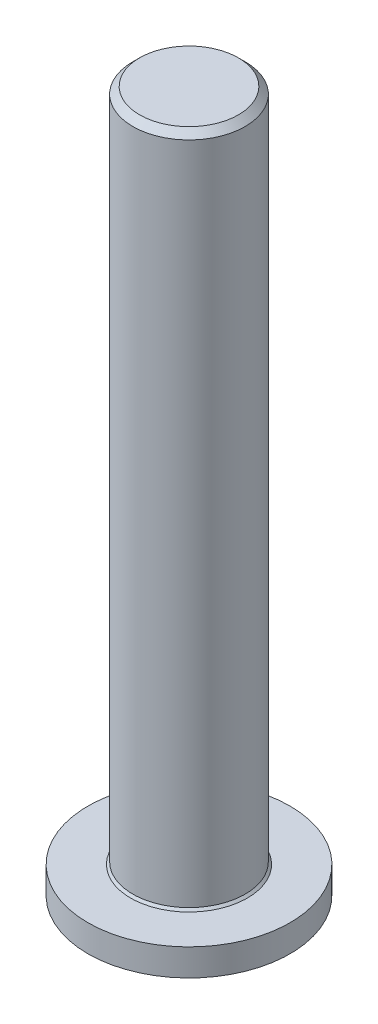
ISO-10303-21;
HEADER;
FILE_DESCRIPTION(('STEP AP214'),'2;1');
FILE_NAME('part.step','',(''),(''),'','','');
FILE_SCHEMA(('AUTOMOTIVE_DESIGN { 1 0 10303 214 1 1 1 1 }'));
ENDSEC;
DATA;
#1=APPLICATION_CONTEXT('core data for automotive mechanical design processes');
#2=APPLICATION_PROTOCOL_DEFINITION('international standard','automotive_design',2000,#1);
#3=PRODUCT_CONTEXT('',#1,'mechanical');
#4=PRODUCT('Part','Part','',(#3));
#5=PRODUCT_RELATED_PRODUCT_CATEGORY('part','',(#4));
#6=PRODUCT_DEFINITION_FORMATION('','',#4);
#7=PRODUCT_DEFINITION_CONTEXT('part definition',#1,'design');
#8=PRODUCT_DEFINITION('design','',#6,#7);
#9=PRODUCT_DEFINITION_SHAPE('','',#8);
#10=(LENGTH_UNIT() NAMED_UNIT(*) SI_UNIT(.MILLI.,.METRE.));
#11=(NAMED_UNIT(*) PLANE_ANGLE_UNIT() SI_UNIT($,.RADIAN.));
#12=(NAMED_UNIT(*) SI_UNIT($,.STERADIAN.) SOLID_ANGLE_UNIT());
#13=UNCERTAINTY_MEASURE_WITH_UNIT(LENGTH_MEASURE(1.E-05),#10,'distance_accuracy_value','');
#14=(GEOMETRIC_REPRESENTATION_CONTEXT(3) GLOBAL_UNCERTAINTY_ASSIGNED_CONTEXT((#13)) GLOBAL_UNIT_ASSIGNED_CONTEXT((#10,
#11,#12)) REPRESENTATION_CONTEXT('',''));
#15=CARTESIAN_POINT('',(0.,0.,0.));
#16=DIRECTION('',(0.,0.,1.));
#17=DIRECTION('',(1.,0.,0.));
#18=AXIS2_PLACEMENT_3D('',#15,#16,#17);
#19=CARTESIAN_POINT('',(0.,1.5,0.));
#20=DIRECTION('',(0.,1.,0.));
#21=DIRECTION('',(0.,0.,1.));
#22=AXIS2_PLACEMENT_3D('',#19,#20,#21);
#23=PLANE('',#22);
#24=CARTESIAN_POINT('',(0.,1.5,0.));
#25=DIRECTION('',(0.,1.,0.));
#26=DIRECTION('',(0.,0.,1.));
#27=AXIS2_PLACEMENT_3D('',#24,#25,#26);
#28=CIRCLE('',#27,2.59999999999999);
#29=CARTESIAN_POINT('',(0.,1.5,-2.59999999999999));
#30=VERTEX_POINT('',#29);
#31=EDGE_CURVE('E148',#30,#30,#28,.F.);
#32=ORIENTED_EDGE('',*,*,#31,.T.);
#33=EDGE_LOOP('',(#32));
#34=FACE_BOUND('',#33,.T.);
#35=CARTESIAN_POINT('',(0.,1.5,0.));
#36=DIRECTION('',(0.,1.,0.));
#37=DIRECTION('',(0.,0.,1.));
#38=AXIS2_PLACEMENT_3D('',#35,#36,#37);
#39=CIRCLE('',#38,4.5);
#40=CARTESIAN_POINT('',(0.,1.5,4.5));
#41=VERTEX_POINT('',#40);
#42=EDGE_CURVE('E137',#41,#41,#39,.T.);
#43=ORIENTED_EDGE('',*,*,#42,.T.);
#44=EDGE_LOOP('',(#43));
#45=FACE_BOUND('',#44,.T.);
#46=ADVANCED_FACE('F35',(#34,#45),#23,.T.);
#47=CARTESIAN_POINT('',(0.,1.5,0.));
#48=DIRECTION('',(0.,-1.,0.));
#49=DIRECTION('',(0.,0.,-1.));
#50=AXIS2_PLACEMENT_3D('',#47,#48,#49);
#51=CYLINDRICAL_SURFACE('',#50,4.5);
#52=CARTESIAN_POINT('',(0.,0.3,0.));
#53=DIRECTION('',(0.,1.,0.));
#54=DIRECTION('',(0.,0.,1.));
#55=AXIS2_PLACEMENT_3D('',#52,#53,#54);
#56=CIRCLE('',#55,4.5);
#57=CARTESIAN_POINT('',(0.,0.3,4.5));
#58=VERTEX_POINT('',#57);
#59=EDGE_CURVE('E151',#58,#58,#56,.T.);
#60=ORIENTED_EDGE('',*,*,#59,.T.);
#61=EDGE_LOOP('',(#60));
#62=FACE_BOUND('',#61,.T.);
#63=ORIENTED_EDGE('',*,*,#42,.F.);
#64=EDGE_LOOP('',(#63));
#65=FACE_BOUND('',#64,.T.);
#66=ADVANCED_FACE('F170',(#62,#65),#51,.T.);
#67=CARTESIAN_POINT('',(0.,0.,0.));
#68=DIRECTION('',(0.,1.,0.));
#69=DIRECTION('',(0.,0.,1.));
#70=AXIS2_PLACEMENT_3D('',#67,#68,#69);
#71=PLANE('',#70);
#72=DIRECTION('',(-0.717801415460528,0.,-0.696247892609279));
#73=VECTOR('',#72,1.);
#74=CARTESIAN_POINT('',(-0.422737578252671,0.,1.6796704855218));
#75=LINE('',#74,#73);
#76=CARTESIAN_POINT('',(-0.422737578252671,0.,1.6796704855218));
#77=VERTEX_POINT('',#76);
#78=CARTESIAN_POINT('',(-1.66600609957516,0.,0.473733760859775));
#79=VERTEX_POINT('',#78);
#80=EDGE_CURVE('E124',#77,#79,#75,.T.);
#81=ORIENTED_EDGE('',*,*,#80,.F.);
#82=DIRECTION('',(-0.961869070061279,0.,0.273510314356606));
#83=VECTOR('',#82,1.);
#84=CARTESIAN_POINT('',(1.24326852132249,0.,1.20593672466203));
#85=LINE('',#84,#83);
#86=CARTESIAN_POINT('',(1.24326852132249,0.,1.20593672466203));
#87=VERTEX_POINT('',#86);
#88=EDGE_CURVE('E50',#87,#77,#85,.T.);
#89=ORIENTED_EDGE('',*,*,#88,.F.);
#90=DIRECTION('',(-0.244067654600751,0.,0.969758206965885));
#91=VECTOR('',#90,1.);
#92=CARTESIAN_POINT('',(1.66600609957516,0.,-0.473733760859776));
#93=LINE('',#92,#91);
#94=CARTESIAN_POINT('',(1.66600609957516,0.,-0.473733760859776));
#95=VERTEX_POINT('',#94);
#96=EDGE_CURVE('E133',#95,#87,#93,.T.);
#97=ORIENTED_EDGE('',*,*,#96,.F.);
#98=DIRECTION('',(0.717801415460528,0.,0.696247892609279));
#99=VECTOR('',#98,1.);
#100=CARTESIAN_POINT('',(0.422737578252671,0.,-1.6796704855218));
#101=LINE('',#100,#99);
#102=CARTESIAN_POINT('',(0.422737578252671,0.,-1.6796704855218));
#103=VERTEX_POINT('',#102);
#104=EDGE_CURVE('E131',#103,#95,#101,.T.);
#105=ORIENTED_EDGE('',*,*,#104,.F.);
#106=DIRECTION('',(0.961869070061279,0.,-0.273510314356606));
#107=VECTOR('',#106,1.);
#108=CARTESIAN_POINT('',(-1.24326852132249,0.,-1.20593672466203));
#109=LINE('',#108,#107);
#110=CARTESIAN_POINT('',(-1.24326852132249,0.,-1.20593672466203));
#111=VERTEX_POINT('',#110);
#112=EDGE_CURVE('E98',#111,#103,#109,.T.);
#113=ORIENTED_EDGE('',*,*,#112,.F.);
#114=DIRECTION('',(0.244067654600751,0.,-0.969758206965885));
#115=VECTOR('',#114,1.);
#116=CARTESIAN_POINT('',(-1.66600609957516,0.,0.473733760859775));
#117=LINE('',#116,#115);
#118=EDGE_CURVE('E127',#79,#111,#117,.T.);
#119=ORIENTED_EDGE('',*,*,#118,.F.);
#120=EDGE_LOOP('',(#81,#89,#97,#105,#113,#119));
#121=FACE_BOUND('',#120,.T.);
#122=CARTESIAN_POINT('',(0.,0.,0.));
#123=DIRECTION('',(0.,1.,0.));
#124=DIRECTION('',(0.,0.,1.));
#125=AXIS2_PLACEMENT_3D('',#122,#123,#124);
#126=CIRCLE('',#125,3.75);
#127=CARTESIAN_POINT('',(0.,0.,3.75));
#128=VERTEX_POINT('',#127);
#129=EDGE_CURVE('E154',#128,#128,#126,.F.);
#130=ORIENTED_EDGE('',*,*,#129,.T.);
#131=EDGE_LOOP('',(#130));
#132=FACE_BOUND('',#131,.T.);
#133=ADVANCED_FACE('F176',(#121,#132),#71,.F.);
#134=CARTESIAN_POINT('',(0.,31.5,0.));
#135=DIRECTION('',(0.,-1.,0.));
#136=DIRECTION('',(0.,0.,-1.));
#137=AXIS2_PLACEMENT_3D('',#134,#135,#136);
#138=CYLINDRICAL_SURFACE('',#137,2.5);
#139=CARTESIAN_POINT('',(0.,31.2,0.));
#140=DIRECTION('',(0.,1.,0.));
#141=DIRECTION('',(0.,0.,1.));
#142=AXIS2_PLACEMENT_3D('',#139,#140,#141);
#143=CIRCLE('',#142,2.5);
#144=CARTESIAN_POINT('',(0.,31.2,2.5));
#145=VERTEX_POINT('',#144);
#146=EDGE_CURVE('E11',#145,#145,#143,.F.);
#147=ORIENTED_EDGE('',*,*,#146,.T.);
#148=EDGE_LOOP('',(#147));
#149=FACE_BOUND('',#148,.T.);
#150=CARTESIAN_POINT('',(0.,1.59999999999999,0.));
#151=DIRECTION('',(0.,1.,0.));
#152=DIRECTION('',(0.,0.,1.));
#153=AXIS2_PLACEMENT_3D('',#150,#151,#152);
#154=CIRCLE('',#153,2.5);
#155=CARTESIAN_POINT('',(0.,1.59999999999999,-2.5));
#156=VERTEX_POINT('',#155);
#157=EDGE_CURVE('E145',#156,#156,#154,.T.);
#158=ORIENTED_EDGE('',*,*,#157,.T.);
#159=EDGE_LOOP('',(#158));
#160=FACE_BOUND('',#159,.T.);
#161=ADVANCED_FACE('F182',(#149,#160),#138,.T.);
#162=CARTESIAN_POINT('',(0.,31.5,0.));
#163=DIRECTION('',(0.,1.,0.));
#164=DIRECTION('',(0.,0.,1.));
#165=AXIS2_PLACEMENT_3D('',#162,#163,#164);
#166=PLANE('',#165);
#167=CARTESIAN_POINT('',(0.,31.5,0.));
#168=DIRECTION('',(0.,1.,0.));
#169=DIRECTION('',(0.,0.,1.));
#170=AXIS2_PLACEMENT_3D('',#167,#168,#169);
#171=CIRCLE('',#170,2.2);
#172=CARTESIAN_POINT('',(0.,31.5,2.2));
#173=VERTEX_POINT('',#172);
#174=EDGE_CURVE('E43',#173,#173,#171,.T.);
#175=ORIENTED_EDGE('',*,*,#174,.T.);
#176=EDGE_LOOP('',(#175));
#177=FACE_BOUND('',#176,.T.);
#178=ADVANCED_FACE('F159',(#177),#166,.T.);
#179=CARTESIAN_POINT('',(0.,1.59999999999999,0.));
#180=DIRECTION('',(0.,-1.,0.));
#181=DIRECTION('',(0.,0.,-1.));
#182=AXIS2_PLACEMENT_3D('',#179,#180,#181);
#183=CONICAL_SURFACE('',#182,2.5,0.785398163397459);
#184=CARTESIAN_POINT('',(0.,1.5,-2.59999999999999));
#185=CARTESIAN_POINT('',(0.,1.50104166666667,-2.59895833333333));
#186=CARTESIAN_POINT('',(0.,1.50208333333333,-2.59791666666666));
#187=CARTESIAN_POINT('',(0.,1.50416666666667,-2.59583333333333));
#188=CARTESIAN_POINT('',(0.,1.50520833333333,-2.59479166666666));
#189=CARTESIAN_POINT('',(0.,1.50729166666667,-2.59270833333333));
#190=CARTESIAN_POINT('',(0.,1.50833333333333,-2.59166666666666));
#191=CARTESIAN_POINT('',(0.,1.51041666666667,-2.58958333333333));
#192=CARTESIAN_POINT('',(0.,1.51145833333333,-2.58854166666666));
#193=CARTESIAN_POINT('',(0.,1.51354166666667,-2.58645833333333));
#194=CARTESIAN_POINT('',(0.,1.51458333333333,-2.58541666666666));
#195=CARTESIAN_POINT('',(0.,1.51666666666666,-2.58333333333333));
#196=CARTESIAN_POINT('',(0.,1.51770833333333,-2.58229166666666));
#197=CARTESIAN_POINT('',(0.,1.51979166666666,-2.58020833333333));
#198=CARTESIAN_POINT('',(0.,1.52083333333333,-2.57916666666666));
#199=CARTESIAN_POINT('',(0.,1.52291666666666,-2.57708333333333));
#200=CARTESIAN_POINT('',(0.,1.52395833333333,-2.57604166666666));
#201=CARTESIAN_POINT('',(0.,1.52604166666666,-2.57395833333333));
#202=CARTESIAN_POINT('',(0.,1.52708333333333,-2.57291666666666));
#203=CARTESIAN_POINT('',(0.,1.52916666666666,-2.57083333333333));
#204=CARTESIAN_POINT('',(0.,1.53020833333333,-2.56979166666666));
#205=CARTESIAN_POINT('',(0.,1.53229166666666,-2.56770833333333));
#206=CARTESIAN_POINT('',(0.,1.53333333333333,-2.56666666666666));
#207=CARTESIAN_POINT('',(0.,1.53541666666666,-2.56458333333333));
#208=CARTESIAN_POINT('',(0.,1.53645833333333,-2.56354166666666));
#209=CARTESIAN_POINT('',(0.,1.53854166666666,-2.56145833333333));
#210=CARTESIAN_POINT('',(0.,1.53958333333333,-2.56041666666666));
#211=CARTESIAN_POINT('',(0.,1.54166666666666,-2.55833333333333));
#212=CARTESIAN_POINT('',(0.,1.54270833333333,-2.55729166666666));
#213=CARTESIAN_POINT('',(0.,1.54479166666666,-2.55520833333333));
#214=CARTESIAN_POINT('',(0.,1.54583333333333,-2.55416666666666));
#215=CARTESIAN_POINT('',(0.,1.54791666666666,-2.55208333333333));
#216=CARTESIAN_POINT('',(0.,1.54895833333333,-2.55104166666666));
#217=CARTESIAN_POINT('',(0.,1.55104166666666,-2.54895833333333));
#218=CARTESIAN_POINT('',(0.,1.55208333333333,-2.54791666666666));
#219=CARTESIAN_POINT('',(0.,1.55416666666666,-2.54583333333333));
#220=CARTESIAN_POINT('',(0.,1.55520833333333,-2.54479166666666));
#221=CARTESIAN_POINT('',(0.,1.55729166666666,-2.54270833333333));
#222=CARTESIAN_POINT('',(0.,1.55833333333333,-2.54166666666666));
#223=CARTESIAN_POINT('',(0.,1.56041666666666,-2.53958333333333));
#224=CARTESIAN_POINT('',(0.,1.56145833333333,-2.53854166666666));
#225=CARTESIAN_POINT('',(0.,1.56354166666666,-2.53645833333333));
#226=CARTESIAN_POINT('',(0.,1.56458333333333,-2.53541666666666));
#227=CARTESIAN_POINT('',(0.,1.56666666666666,-2.53333333333333));
#228=CARTESIAN_POINT('',(0.,1.56770833333333,-2.53229166666666));
#229=CARTESIAN_POINT('',(0.,1.56979166666666,-2.53020833333333));
#230=CARTESIAN_POINT('',(0.,1.57083333333333,-2.52916666666667));
#231=CARTESIAN_POINT('',(0.,1.57291666666666,-2.52708333333333));
#232=CARTESIAN_POINT('',(0.,1.57395833333333,-2.52604166666666));
#233=CARTESIAN_POINT('',(0.,1.57604166666666,-2.52395833333333));
#234=CARTESIAN_POINT('',(0.,1.57708333333333,-2.52291666666666));
#235=CARTESIAN_POINT('',(0.,1.57916666666666,-2.52083333333333));
#236=CARTESIAN_POINT('',(0.,1.58020833333333,-2.51979166666667));
#237=CARTESIAN_POINT('',(0.,1.58229166666666,-2.51770833333333));
#238=CARTESIAN_POINT('',(0.,1.58333333333333,-2.51666666666667));
#239=CARTESIAN_POINT('',(0.,1.58541666666666,-2.51458333333333));
#240=CARTESIAN_POINT('',(0.,1.58645833333332,-2.51354166666667));
#241=CARTESIAN_POINT('',(0.,1.58854166666666,-2.51145833333333));
#242=CARTESIAN_POINT('',(0.,1.58958333333332,-2.51041666666667));
#243=CARTESIAN_POINT('',(0.,1.59166666666666,-2.50833333333333));
#244=CARTESIAN_POINT('',(0.,1.59270833333332,-2.50729166666667));
#245=CARTESIAN_POINT('',(0.,1.59479166666666,-2.50520833333333));
#246=CARTESIAN_POINT('',(0.,1.59583333333332,-2.50416666666667));
#247=CARTESIAN_POINT('',(0.,1.59791666666666,-2.50208333333333));
#248=CARTESIAN_POINT('',(0.,1.59895833333332,-2.50104166666667));
#249=CARTESIAN_POINT('',(0.,1.59999999999999,-2.5));
#250=B_SPLINE_CURVE_WITH_KNOTS('',3,(#184,#185,#186,#187,#188,#189,#190,#191,#192,#193,#194,
#195,#196,#197,#198,#199,#200,#201,#202,#203,#204,#205,#206,#207,#208,#209,#210,#211,#212,#213,
#214,#215,#216,#217,#218,#219,#220,#221,#222,#223,#224,#225,#226,#227,#228,#229,#230,#231,#232,
#233,#234,#235,#236,#237,#238,#239,#240,#241,#242,#243,#244,#245,#246,#247,#248,#249),
.UNSPECIFIED.,.F.,.F.,(4,2,2,2,2,2,2,2,2,2,2,2,2,2,2,2,2,2,2,2,2,2,2,2,2,2,2,2,2,2,2,2,4),(0.,
0.00441941738241559,0.00883883476483102,0.0132582521472465,0.0176776695296622,
0.0220970869120776,0.0265165042944932,0.0309359216769087,0.0353553390593244,0.0397747564417398,
0.0441941738241553,0.0486135912065709,0.0530330085889866,0.057452425971402,0.0618718433538175,
0.0662912607362329,0.0707106781186486,0.0751300955010642,0.0795495128834797,0.0839689302658951,
0.0883883476483109,0.0928077650307263,0.0972271824131419,0.101646599795557,0.106066017177973,
0.110485434560388,0.114904851942804,0.11932426932522,0.123743686707635,0.128163104090051,
0.132582521472466,0.137001938854882,0.141421356237298),.UNSPECIFIED.);
#251=EDGE_CURVE('BSEAM187',#30,#156,#250,.T.);
#252=ORIENTED_EDGE('',*,*,#31,.F.);
#253=ORIENTED_EDGE('',*,*,#157,.F.);
#254=ORIENTED_EDGE('',*,*,#251,.T.);
#255=ORIENTED_EDGE('',*,*,#251,.F.);
#256=EDGE_LOOP('',(#252,#254,#253,#255));
#257=FACE_BOUND('',#256,.T.);
#258=ADVANCED_FACE('F187',(#257),#183,.T.);
#259=CARTESIAN_POINT('',(0.,0.3,0.));
#260=DIRECTION('',(0.,1.,0.));
#261=DIRECTION('',(0.,0.,1.));
#262=AXIS2_PLACEMENT_3D('',#259,#260,#261);
#263=CONICAL_SURFACE('',#262,4.5,1.19028994968253);
#264=ORIENTED_EDGE('',*,*,#129,.F.);
#265=EDGE_LOOP('',(#264));
#266=FACE_BOUND('',#265,.T.);
#267=ORIENTED_EDGE('',*,*,#59,.F.);
#268=EDGE_LOOP('',(#267));
#269=FACE_BOUND('',#268,.T.);
#270=ADVANCED_FACE('F189',(#266,#269),#263,.T.);
#271=CARTESIAN_POINT('',(1.24326852132249,3.,1.20593672466203));
#272=DIRECTION('',(0.273510314356606,0.,0.961869070061279));
#273=DIRECTION('',(0.961869070061279,0.,-0.273510314356606));
#274=AXIS2_PLACEMENT_3D('',#271,#272,#273);
#275=PLANE('',#274);
#276=ORIENTED_EDGE('',*,*,#88,.T.);
#277=DIRECTION('',(0.,-1.,0.));
#278=VECTOR('',#277,1.);
#279=CARTESIAN_POINT('',(-0.422737578252671,3.,1.6796704855218));
#280=LINE('',#279,#278);
#281=CARTESIAN_POINT('',(-0.422737578252671,3.,1.6796704855218));
#282=VERTEX_POINT('',#281);
#283=EDGE_CURVE('E80',#282,#77,#280,.T.);
#284=ORIENTED_EDGE('',*,*,#283,.F.);
#285=DIRECTION('',(-0.961869070061279,0.,0.273510314356606));
#286=VECTOR('',#285,1.);
#287=CARTESIAN_POINT('',(1.24326852132249,3.,1.20593672466203));
#288=LINE('',#287,#286);
#289=CARTESIAN_POINT('',(1.24326852132249,3.,1.20593672466203));
#290=VERTEX_POINT('',#289);
#291=EDGE_CURVE('E135',#290,#282,#288,.T.);
#292=ORIENTED_EDGE('',*,*,#291,.F.);
#293=DIRECTION('',(0.,-1.,0.));
#294=VECTOR('',#293,1.);
#295=CARTESIAN_POINT('',(1.24326852132249,3.,1.20593672466203));
#296=LINE('',#295,#294);
#297=EDGE_CURVE('E58',#290,#87,#296,.T.);
#298=ORIENTED_EDGE('',*,*,#297,.T.);
#299=EDGE_LOOP('',(#276,#284,#292,#298));
#300=FACE_BOUND('',#299,.T.);
#301=ADVANCED_FACE('F192',(#300),#275,.F.);
#302=CARTESIAN_POINT('',(1.66600609957516,3.,-0.473733760859776));
#303=DIRECTION('',(0.969758206965885,0.,0.244067654600751));
#304=DIRECTION('',(0.244067654600751,0.,-0.969758206965885));
#305=AXIS2_PLACEMENT_3D('',#302,#303,#304);
#306=PLANE('',#305);
#307=ORIENTED_EDGE('',*,*,#96,.T.);
#308=ORIENTED_EDGE('',*,*,#297,.F.);
#309=DIRECTION('',(-0.244067654600751,0.,0.969758206965885));
#310=VECTOR('',#309,1.);
#311=CARTESIAN_POINT('',(1.66600609957516,3.,-0.473733760859776));
#312=LINE('',#311,#310);
#313=CARTESIAN_POINT('',(1.66600609957516,3.,-0.473733760859776));
#314=VERTEX_POINT('',#313);
#315=EDGE_CURVE('E110',#314,#290,#312,.T.);
#316=ORIENTED_EDGE('',*,*,#315,.F.);
#317=DIRECTION('',(0.,-1.,0.));
#318=VECTOR('',#317,1.);
#319=CARTESIAN_POINT('',(1.66600609957516,3.,-0.473733760859776));
#320=LINE('',#319,#318);
#321=EDGE_CURVE('E102',#314,#95,#320,.T.);
#322=ORIENTED_EDGE('',*,*,#321,.T.);
#323=EDGE_LOOP('',(#307,#308,#316,#322));
#324=FACE_BOUND('',#323,.T.);
#325=ADVANCED_FACE('F197',(#324),#306,.F.);
#326=CARTESIAN_POINT('',(0.422737578252671,3.,-1.6796704855218));
#327=DIRECTION('',(0.696247892609279,0.,-0.717801415460528));
#328=DIRECTION('',(-0.717801415460528,0.,-0.696247892609279));
#329=AXIS2_PLACEMENT_3D('',#326,#327,#328);
#330=PLANE('',#329);
#331=ORIENTED_EDGE('',*,*,#104,.T.);
#332=ORIENTED_EDGE('',*,*,#321,.F.);
#333=DIRECTION('',(0.717801415460528,0.,0.696247892609279));
#334=VECTOR('',#333,1.);
#335=CARTESIAN_POINT('',(0.422737578252671,3.,-1.6796704855218));
#336=LINE('',#335,#334);
#337=CARTESIAN_POINT('',(0.422737578252671,3.,-1.6796704855218));
#338=VERTEX_POINT('',#337);
#339=EDGE_CURVE('E106',#338,#314,#336,.T.);
#340=ORIENTED_EDGE('',*,*,#339,.F.);
#341=DIRECTION('',(0.,-1.,0.));
#342=VECTOR('',#341,1.);
#343=CARTESIAN_POINT('',(0.422737578252671,3.,-1.6796704855218));
#344=LINE('',#343,#342);
#345=EDGE_CURVE('E91',#338,#103,#344,.T.);
#346=ORIENTED_EDGE('',*,*,#345,.T.);
#347=EDGE_LOOP('',(#331,#332,#340,#346));
#348=FACE_BOUND('',#347,.T.);
#349=ADVANCED_FACE('F107',(#348),#330,.F.);
#350=CARTESIAN_POINT('',(-1.24326852132249,3.,-1.20593672466203));
#351=DIRECTION('',(-0.273510314356606,0.,-0.961869070061279));
#352=DIRECTION('',(-0.961869070061279,0.,0.273510314356606));
#353=AXIS2_PLACEMENT_3D('',#350,#351,#352);
#354=PLANE('',#353);
#355=ORIENTED_EDGE('',*,*,#112,.T.);
#356=ORIENTED_EDGE('',*,*,#345,.F.);
#357=DIRECTION('',(0.961869070061279,0.,-0.273510314356606));
#358=VECTOR('',#357,1.);
#359=CARTESIAN_POINT('',(-1.24326852132249,3.,-1.20593672466203));
#360=LINE('',#359,#358);
#361=CARTESIAN_POINT('',(-1.24326852132249,3.,-1.20593672466203));
#362=VERTEX_POINT('',#361);
#363=EDGE_CURVE('E95',#362,#338,#360,.T.);
#364=ORIENTED_EDGE('',*,*,#363,.F.);
#365=DIRECTION('',(0.,-1.,0.));
#366=VECTOR('',#365,1.);
#367=CARTESIAN_POINT('',(-1.24326852132249,3.,-1.20593672466203));
#368=LINE('',#367,#366);
#369=EDGE_CURVE('E103',#362,#111,#368,.T.);
#370=ORIENTED_EDGE('',*,*,#369,.T.);
#371=EDGE_LOOP('',(#355,#356,#364,#370));
#372=FACE_BOUND('',#371,.T.);
#373=ADVANCED_FACE('F93',(#372),#354,.F.);
#374=CARTESIAN_POINT('',(-1.66600609957516,3.,0.473733760859775));
#375=DIRECTION('',(-0.969758206965885,0.,-0.244067654600751));
#376=DIRECTION('',(-0.244067654600751,0.,0.969758206965885));
#377=AXIS2_PLACEMENT_3D('',#374,#375,#376);
#378=PLANE('',#377);
#379=ORIENTED_EDGE('',*,*,#118,.T.);
#380=ORIENTED_EDGE('',*,*,#369,.F.);
#381=DIRECTION('',(0.244067654600751,0.,-0.969758206965885));
#382=VECTOR('',#381,1.);
#383=CARTESIAN_POINT('',(-1.66600609957516,3.,0.473733760859775));
#384=LINE('',#383,#382);
#385=CARTESIAN_POINT('',(-1.66600609957516,3.,0.473733760859775));
#386=VERTEX_POINT('',#385);
#387=EDGE_CURVE('E116',#386,#362,#384,.T.);
#388=ORIENTED_EDGE('',*,*,#387,.F.);
#389=DIRECTION('',(0.,-1.,0.));
#390=VECTOR('',#389,1.);
#391=CARTESIAN_POINT('',(-1.66600609957516,3.,0.473733760859775));
#392=LINE('',#391,#390);
#393=EDGE_CURVE('E140',#386,#79,#392,.T.);
#394=ORIENTED_EDGE('',*,*,#393,.T.);
#395=EDGE_LOOP('',(#379,#380,#388,#394));
#396=FACE_BOUND('',#395,.T.);
#397=ADVANCED_FACE('F266',(#396),#378,.F.);
#398=CARTESIAN_POINT('',(-0.422737578252671,3.,1.6796704855218));
#399=DIRECTION('',(-0.696247892609279,0.,0.717801415460528));
#400=DIRECTION('',(0.717801415460528,0.,0.696247892609279));
#401=AXIS2_PLACEMENT_3D('',#398,#399,#400);
#402=PLANE('',#401);
#403=ORIENTED_EDGE('',*,*,#80,.T.);
#404=ORIENTED_EDGE('',*,*,#393,.F.);
#405=DIRECTION('',(-0.717801415460528,0.,-0.696247892609279));
#406=VECTOR('',#405,1.);
#407=CARTESIAN_POINT('',(-0.422737578252671,3.,1.6796704855218));
#408=LINE('',#407,#406);
#409=EDGE_CURVE('E118',#282,#386,#408,.T.);
#410=ORIENTED_EDGE('',*,*,#409,.F.);
#411=ORIENTED_EDGE('',*,*,#283,.T.);
#412=EDGE_LOOP('',(#403,#404,#410,#411));
#413=FACE_BOUND('',#412,.T.);
#414=ADVANCED_FACE('F166',(#413),#402,.F.);
#415=CARTESIAN_POINT('',(0.,3.,0.));
#416=DIRECTION('',(0.,-1.,0.));
#417=DIRECTION('',(0.,0.,-1.));
#418=AXIS2_PLACEMENT_3D('',#415,#416,#417);
#419=PLANE('',#418);
#420=ORIENTED_EDGE('',*,*,#291,.T.);
#421=ORIENTED_EDGE('',*,*,#409,.T.);
#422=ORIENTED_EDGE('',*,*,#387,.T.);
#423=ORIENTED_EDGE('',*,*,#363,.T.);
#424=ORIENTED_EDGE('',*,*,#339,.T.);
#425=ORIENTED_EDGE('',*,*,#315,.T.);
#426=EDGE_LOOP('',(#420,#421,#422,#423,#424,#425));
#427=FACE_BOUND('',#426,.T.);
#428=ADVANCED_FACE('F113',(#427),#419,.T.);
#429=CARTESIAN_POINT('',(0.,31.5,0.));
#430=DIRECTION('',(0.,-1.,0.));
#431=DIRECTION('',(0.,0.,-1.));
#432=AXIS2_PLACEMENT_3D('',#429,#430,#431);
#433=CONICAL_SURFACE('',#432,2.2,0.78539816339745);
#434=ORIENTED_EDGE('',*,*,#146,.F.);
#435=EDGE_LOOP('',(#434));
#436=FACE_BOUND('',#435,.T.);
#437=ORIENTED_EDGE('',*,*,#174,.F.);
#438=EDGE_LOOP('',(#437));
#439=FACE_BOUND('',#438,.T.);
#440=ADVANCED_FACE('F37',(#436,#439),#433,.T.);
#441=CLOSED_SHELL('',(#46,#66,#133,#161,#178,#258,#270,#301,#325,#349,#373,#397,#414,#428,#440));
#442=MANIFOLD_SOLID_BREP('B2',#441);
#443=ADVANCED_BREP_SHAPE_REPRESENTATION('',(#18,#442),#14);
#444=SHAPE_DEFINITION_REPRESENTATION(#9,#443);
ENDSEC;
END-ISO-10303-21;
